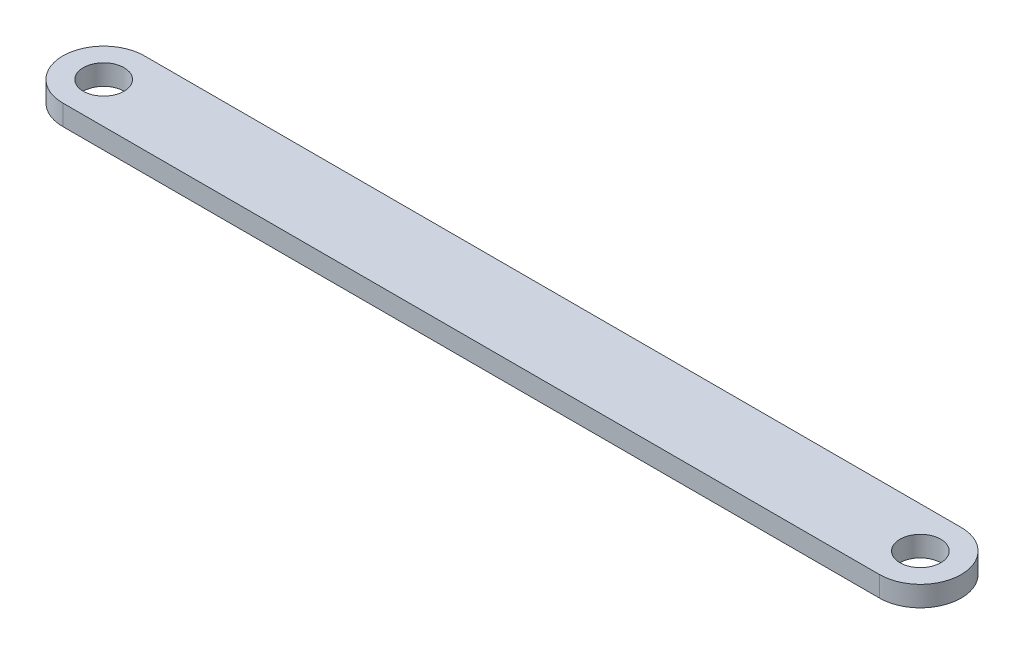
ISO-10303-21;
HEADER;
FILE_DESCRIPTION(('STEP AP214'),'2;1');
FILE_NAME('part.step','',(''),(''),'','','');
FILE_SCHEMA(('AUTOMOTIVE_DESIGN { 1 0 10303 214 1 1 1 1 }'));
ENDSEC;
DATA;
#1=APPLICATION_CONTEXT('core data for automotive mechanical design processes');
#2=APPLICATION_PROTOCOL_DEFINITION('international standard','automotive_design',2000,#1);
#3=PRODUCT_CONTEXT('',#1,'mechanical');
#4=PRODUCT('Part','Part','',(#3));
#5=PRODUCT_RELATED_PRODUCT_CATEGORY('part','',(#4));
#6=PRODUCT_DEFINITION_FORMATION('','',#4);
#7=PRODUCT_DEFINITION_CONTEXT('part definition',#1,'design');
#8=PRODUCT_DEFINITION('design','',#6,#7);
#9=PRODUCT_DEFINITION_SHAPE('','',#8);
#10=(LENGTH_UNIT() NAMED_UNIT(*) SI_UNIT(.MILLI.,.METRE.));
#11=(NAMED_UNIT(*) PLANE_ANGLE_UNIT() SI_UNIT($,.RADIAN.));
#12=(NAMED_UNIT(*) SI_UNIT($,.STERADIAN.) SOLID_ANGLE_UNIT());
#13=UNCERTAINTY_MEASURE_WITH_UNIT(LENGTH_MEASURE(1.E-05),#10,'distance_accuracy_value','');
#14=(GEOMETRIC_REPRESENTATION_CONTEXT(3) GLOBAL_UNCERTAINTY_ASSIGNED_CONTEXT((#13)) GLOBAL_UNIT_ASSIGNED_CONTEXT((#10,
#11,#12)) REPRESENTATION_CONTEXT('',''));
#15=CARTESIAN_POINT('',(0.,0.,0.));
#16=DIRECTION('',(0.,0.,1.));
#17=DIRECTION('',(1.,0.,0.));
#18=AXIS2_PLACEMENT_3D('',#15,#16,#17);
#19=CARTESIAN_POINT('',(-100.,5.,0.));
#20=DIRECTION('',(0.,1.,0.));
#21=DIRECTION('',(0.,0.,1.));
#22=AXIS2_PLACEMENT_3D('',#19,#20,#21);
#23=PLANE('',#22);
#24=CARTESIAN_POINT('',(-100.,5.,0.));
#25=DIRECTION('',(0.,1.,0.));
#26=DIRECTION('',(0.,0.,1.));
#27=AXIS2_PLACEMENT_3D('',#24,#25,#26);
#28=CIRCLE('',#27,5.00000000000002);
#29=CARTESIAN_POINT('',(-100.,5.,5.00000000000002));
#30=VERTEX_POINT('',#29);
#31=EDGE_CURVE('E106',#30,#30,#28,.T.);
#32=ORIENTED_EDGE('',*,*,#31,.F.);
#33=EDGE_LOOP('',(#32));
#34=FACE_BOUND('',#33,.T.);
#35=CARTESIAN_POINT('',(-100.,5.,0.));
#36=DIRECTION('',(0.,1.,0.));
#37=DIRECTION('',(0.,0.,1.));
#38=AXIS2_PLACEMENT_3D('',#35,#36,#37);
#39=CIRCLE('',#38,10.);
#40=CARTESIAN_POINT('',(-100.,5.,-10.));
#41=VERTEX_POINT('',#40);
#42=CARTESIAN_POINT('',(-100.,5.,10.));
#43=VERTEX_POINT('',#42);
#44=EDGE_CURVE('E91',#41,#43,#39,.T.);
#45=ORIENTED_EDGE('',*,*,#44,.T.);
#46=DIRECTION('',(1.,0.,0.));
#47=VECTOR('',#46,1.);
#48=CARTESIAN_POINT('',(-100.,5.,10.));
#49=LINE('',#48,#47);
#50=CARTESIAN_POINT('',(100.,5.,10.));
#51=VERTEX_POINT('',#50);
#52=EDGE_CURVE('E86',#43,#51,#49,.T.);
#53=ORIENTED_EDGE('',*,*,#52,.T.);
#54=CARTESIAN_POINT('',(100.,5.,0.));
#55=DIRECTION('',(0.,1.,0.));
#56=DIRECTION('',(0.,0.,1.));
#57=AXIS2_PLACEMENT_3D('',#54,#55,#56);
#58=CIRCLE('',#57,10.);
#59=CARTESIAN_POINT('',(100.,5.,-10.));
#60=VERTEX_POINT('',#59);
#61=EDGE_CURVE('E89',#51,#60,#58,.T.);
#62=ORIENTED_EDGE('',*,*,#61,.T.);
#63=DIRECTION('',(-1.,0.,0.));
#64=VECTOR('',#63,1.);
#65=CARTESIAN_POINT('',(-100.,5.,-10.));
#66=LINE('',#65,#64);
#67=EDGE_CURVE('E56',#60,#41,#66,.T.);
#68=ORIENTED_EDGE('',*,*,#67,.T.);
#69=EDGE_LOOP('',(#45,#53,#62,#68));
#70=FACE_BOUND('',#69,.T.);
#71=CARTESIAN_POINT('',(100.,5.,0.));
#72=DIRECTION('',(0.,1.,0.));
#73=DIRECTION('',(0.,0.,1.));
#74=AXIS2_PLACEMENT_3D('',#71,#72,#73);
#75=CIRCLE('',#74,5.00000000000002);
#76=CARTESIAN_POINT('',(100.,5.,5.00000000000002));
#77=VERTEX_POINT('',#76);
#78=EDGE_CURVE('E121',#77,#77,#75,.T.);
#79=ORIENTED_EDGE('',*,*,#78,.F.);
#80=EDGE_LOOP('',(#79));
#81=FACE_BOUND('',#80,.T.);
#82=ADVANCED_FACE('F39',(#34,#70,#81),#23,.T.);
#83=CARTESIAN_POINT('',(-100.,0.,0.));
#84=DIRECTION('',(0.,1.,0.));
#85=DIRECTION('',(0.,0.,1.));
#86=AXIS2_PLACEMENT_3D('',#83,#84,#85);
#87=PLANE('',#86);
#88=CARTESIAN_POINT('',(-100.,0.,0.));
#89=DIRECTION('',(0.,1.,0.));
#90=DIRECTION('',(0.,0.,1.));
#91=AXIS2_PLACEMENT_3D('',#88,#89,#90);
#92=CIRCLE('',#91,10.);
#93=CARTESIAN_POINT('',(-100.,0.,-10.));
#94=VERTEX_POINT('',#93);
#95=CARTESIAN_POINT('',(-100.,0.,10.));
#96=VERTEX_POINT('',#95);
#97=EDGE_CURVE('E103',#94,#96,#92,.T.);
#98=ORIENTED_EDGE('',*,*,#97,.F.);
#99=DIRECTION('',(-1.,0.,0.));
#100=VECTOR('',#99,1.);
#101=CARTESIAN_POINT('',(-100.,0.,-10.));
#102=LINE('',#101,#100);
#103=CARTESIAN_POINT('',(100.,0.,-10.));
#104=VERTEX_POINT('',#103);
#105=EDGE_CURVE('E79',#104,#94,#102,.T.);
#106=ORIENTED_EDGE('',*,*,#105,.F.);
#107=CARTESIAN_POINT('',(100.,0.,0.));
#108=DIRECTION('',(0.,1.,0.));
#109=DIRECTION('',(0.,0.,1.));
#110=AXIS2_PLACEMENT_3D('',#107,#108,#109);
#111=CIRCLE('',#110,10.);
#112=CARTESIAN_POINT('',(100.,0.,10.));
#113=VERTEX_POINT('',#112);
#114=EDGE_CURVE('E73',#113,#104,#111,.T.);
#115=ORIENTED_EDGE('',*,*,#114,.F.);
#116=DIRECTION('',(1.,0.,0.));
#117=VECTOR('',#116,1.);
#118=CARTESIAN_POINT('',(-100.,0.,10.));
#119=LINE('',#118,#117);
#120=EDGE_CURVE('E95',#96,#113,#119,.T.);
#121=ORIENTED_EDGE('',*,*,#120,.F.);
#122=EDGE_LOOP('',(#98,#106,#115,#121));
#123=FACE_BOUND('',#122,.T.);
#124=CARTESIAN_POINT('',(-100.,0.,0.));
#125=DIRECTION('',(0.,1.,0.));
#126=DIRECTION('',(0.,0.,1.));
#127=AXIS2_PLACEMENT_3D('',#124,#125,#126);
#128=CIRCLE('',#127,5.00000000000002);
#129=CARTESIAN_POINT('',(-100.,0.,5.00000000000002));
#130=VERTEX_POINT('',#129);
#131=EDGE_CURVE('E118',#130,#130,#128,.T.);
#132=ORIENTED_EDGE('',*,*,#131,.T.);
#133=EDGE_LOOP('',(#132));
#134=FACE_BOUND('',#133,.T.);
#135=CARTESIAN_POINT('',(100.,0.,0.));
#136=DIRECTION('',(0.,1.,0.));
#137=DIRECTION('',(0.,0.,1.));
#138=AXIS2_PLACEMENT_3D('',#135,#136,#137);
#139=CIRCLE('',#138,5.00000000000002);
#140=CARTESIAN_POINT('',(100.,0.,5.00000000000002));
#141=VERTEX_POINT('',#140);
#142=EDGE_CURVE('E124',#141,#141,#139,.T.);
#143=ORIENTED_EDGE('',*,*,#142,.T.);
#144=EDGE_LOOP('',(#143));
#145=FACE_BOUND('',#144,.T.);
#146=ADVANCED_FACE('F114',(#123,#134,#145),#87,.F.);
#147=CARTESIAN_POINT('',(-100.,5.,0.));
#148=DIRECTION('',(0.,-1.,0.));
#149=DIRECTION('',(0.,0.,-1.));
#150=AXIS2_PLACEMENT_3D('',#147,#148,#149);
#151=CYLINDRICAL_SURFACE('',#150,10.);
#152=ORIENTED_EDGE('',*,*,#97,.T.);
#153=DIRECTION('',(0.,-1.,0.));
#154=VECTOR('',#153,1.);
#155=CARTESIAN_POINT('',(-100.,5.,10.));
#156=LINE('',#155,#154);
#157=EDGE_CURVE('E11',#43,#96,#156,.T.);
#158=ORIENTED_EDGE('',*,*,#157,.F.);
#159=ORIENTED_EDGE('',*,*,#44,.F.);
#160=DIRECTION('',(0.,-1.,0.));
#161=VECTOR('',#160,1.);
#162=CARTESIAN_POINT('',(-100.,5.,-10.));
#163=LINE('',#162,#161);
#164=EDGE_CURVE('E99',#41,#94,#163,.T.);
#165=ORIENTED_EDGE('',*,*,#164,.T.);
#166=EDGE_LOOP('',(#152,#158,#159,#165));
#167=FACE_BOUND('',#166,.T.);
#168=ADVANCED_FACE('F41',(#167),#151,.T.);
#169=CARTESIAN_POINT('',(-100.,5.,10.));
#170=DIRECTION('',(0.,0.,-1.));
#171=DIRECTION('',(-1.,0.,0.));
#172=AXIS2_PLACEMENT_3D('',#169,#170,#171);
#173=PLANE('',#172);
#174=ORIENTED_EDGE('',*,*,#120,.T.);
#175=DIRECTION('',(0.,-1.,0.));
#176=VECTOR('',#175,1.);
#177=CARTESIAN_POINT('',(100.,5.,10.));
#178=LINE('',#177,#176);
#179=EDGE_CURVE('E48',#51,#113,#178,.T.);
#180=ORIENTED_EDGE('',*,*,#179,.F.);
#181=ORIENTED_EDGE('',*,*,#52,.F.);
#182=ORIENTED_EDGE('',*,*,#157,.T.);
#183=EDGE_LOOP('',(#174,#180,#181,#182));
#184=FACE_BOUND('',#183,.T.);
#185=ADVANCED_FACE('F94',(#184),#173,.F.);
#186=CARTESIAN_POINT('',(100.,5.,0.));
#187=DIRECTION('',(0.,-1.,0.));
#188=DIRECTION('',(0.,0.,-1.));
#189=AXIS2_PLACEMENT_3D('',#186,#187,#188);
#190=CYLINDRICAL_SURFACE('',#189,10.);
#191=ORIENTED_EDGE('',*,*,#114,.T.);
#192=DIRECTION('',(0.,-1.,0.));
#193=VECTOR('',#192,1.);
#194=CARTESIAN_POINT('',(100.,5.,-10.));
#195=LINE('',#194,#193);
#196=EDGE_CURVE('E96',#60,#104,#195,.T.);
#197=ORIENTED_EDGE('',*,*,#196,.F.);
#198=ORIENTED_EDGE('',*,*,#61,.F.);
#199=ORIENTED_EDGE('',*,*,#179,.T.);
#200=EDGE_LOOP('',(#191,#197,#198,#199));
#201=FACE_BOUND('',#200,.T.);
#202=ADVANCED_FACE('F97',(#201),#190,.T.);
#203=CARTESIAN_POINT('',(-100.,5.,-10.));
#204=DIRECTION('',(0.,0.,1.));
#205=DIRECTION('',(1.,0.,0.));
#206=AXIS2_PLACEMENT_3D('',#203,#204,#205);
#207=PLANE('',#206);
#208=ORIENTED_EDGE('',*,*,#105,.T.);
#209=ORIENTED_EDGE('',*,*,#164,.F.);
#210=ORIENTED_EDGE('',*,*,#67,.F.);
#211=ORIENTED_EDGE('',*,*,#196,.T.);
#212=EDGE_LOOP('',(#208,#209,#210,#211));
#213=FACE_BOUND('',#212,.T.);
#214=ADVANCED_FACE('F111',(#213),#207,.F.);
#215=CARTESIAN_POINT('',(-100.,5.,0.));
#216=DIRECTION('',(0.,-1.,0.));
#217=DIRECTION('',(0.,0.,-1.));
#218=AXIS2_PLACEMENT_3D('',#215,#216,#217);
#219=CYLINDRICAL_SURFACE('',#218,5.00000000000002);
#220=ORIENTED_EDGE('',*,*,#31,.T.);
#221=EDGE_LOOP('',(#220));
#222=FACE_BOUND('',#221,.T.);
#223=ORIENTED_EDGE('',*,*,#131,.F.);
#224=EDGE_LOOP('',(#223));
#225=FACE_BOUND('',#224,.T.);
#226=ADVANCED_FACE('F141',(#222,#225),#219,.F.);
#227=CARTESIAN_POINT('',(100.,5.,0.));
#228=DIRECTION('',(0.,-1.,0.));
#229=DIRECTION('',(0.,0.,-1.));
#230=AXIS2_PLACEMENT_3D('',#227,#228,#229);
#231=CYLINDRICAL_SURFACE('',#230,5.00000000000002);
#232=ORIENTED_EDGE('',*,*,#78,.T.);
#233=EDGE_LOOP('',(#232));
#234=FACE_BOUND('',#233,.T.);
#235=ORIENTED_EDGE('',*,*,#142,.F.);
#236=EDGE_LOOP('',(#235));
#237=FACE_BOUND('',#236,.T.);
#238=ADVANCED_FACE('F130',(#234,#237),#231,.F.);
#239=CLOSED_SHELL('',(#82,#146,#168,#185,#202,#214,#226,#238));
#240=MANIFOLD_SOLID_BREP('B2',#239);
#241=ADVANCED_BREP_SHAPE_REPRESENTATION('',(#18,#240),#14);
#242=SHAPE_DEFINITION_REPRESENTATION(#9,#241);
ENDSEC;
END-ISO-10303-21;
